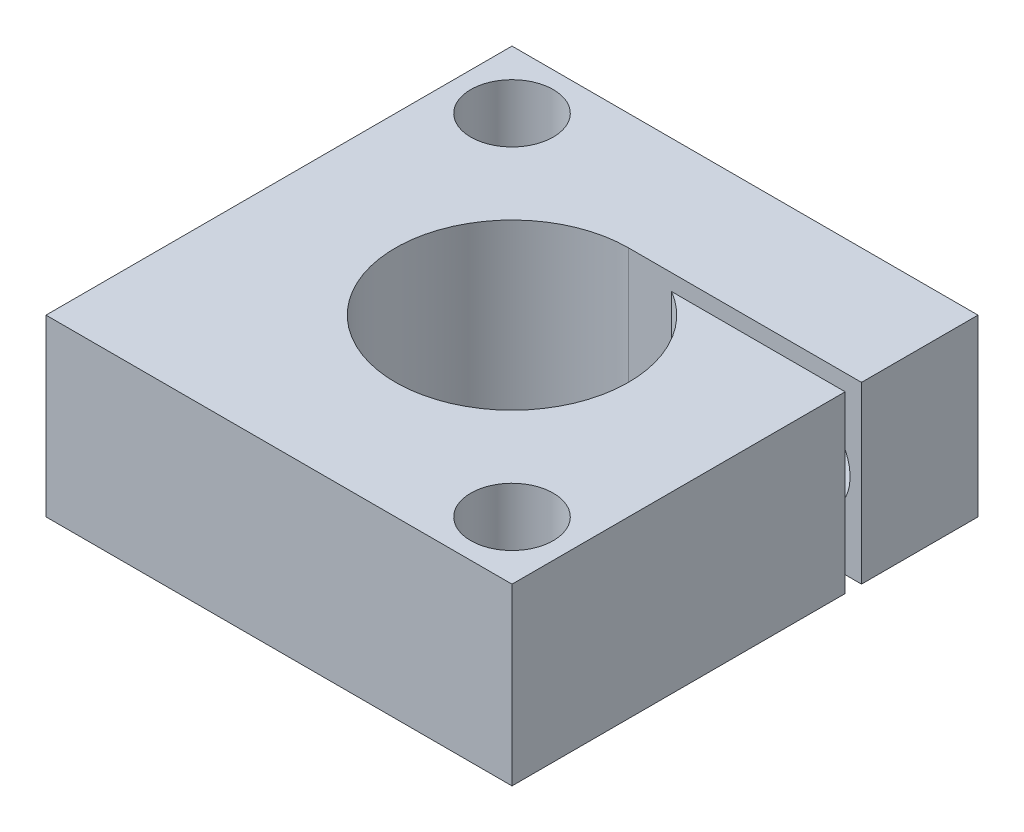
ISO-10303-21;
HEADER;
FILE_DESCRIPTION(('STEP AP214'),'2;1');
FILE_NAME('part.step','',(''),(''),'','','');
FILE_SCHEMA(('AUTOMOTIVE_DESIGN { 1 0 10303 214 1 1 1 1 }'));
ENDSEC;
DATA;
#1=APPLICATION_CONTEXT('core data for automotive mechanical design processes');
#2=APPLICATION_PROTOCOL_DEFINITION('international standard','automotive_design',2000,#1);
#3=PRODUCT_CONTEXT('',#1,'mechanical');
#4=PRODUCT('Part','Part','',(#3));
#5=PRODUCT_RELATED_PRODUCT_CATEGORY('part','',(#4));
#6=PRODUCT_DEFINITION_FORMATION('','',#4);
#7=PRODUCT_DEFINITION_CONTEXT('part definition',#1,'design');
#8=PRODUCT_DEFINITION('design','',#6,#7);
#9=PRODUCT_DEFINITION_SHAPE('','',#8);
#10=(LENGTH_UNIT() NAMED_UNIT(*) SI_UNIT(.MILLI.,.METRE.));
#11=(NAMED_UNIT(*) PLANE_ANGLE_UNIT() SI_UNIT($,.RADIAN.));
#12=(NAMED_UNIT(*) SI_UNIT($,.STERADIAN.) SOLID_ANGLE_UNIT());
#13=UNCERTAINTY_MEASURE_WITH_UNIT(LENGTH_MEASURE(1.E-05),#10,'distance_accuracy_value','');
#14=(GEOMETRIC_REPRESENTATION_CONTEXT(3) GLOBAL_UNCERTAINTY_ASSIGNED_CONTEXT((#13)) GLOBAL_UNIT_ASSIGNED_CONTEXT((#10,
#11,#12)) REPRESENTATION_CONTEXT('',''));
#15=CARTESIAN_POINT('',(0.,0.,0.));
#16=DIRECTION('',(0.,0.,1.));
#17=DIRECTION('',(1.,0.,0.));
#18=AXIS2_PLACEMENT_3D('',#15,#16,#17);
#19=CARTESIAN_POINT('',(-23.8993780326795,9.525,-15.7202520192622));
#20=DIRECTION('',(1.,0.,0.));
#21=DIRECTION('',(0.,0.,-1.));
#22=AXIS2_PLACEMENT_3D('',#19,#20,#21);
#23=PLANE('',#22);
#24=DIRECTION('',(0.,0.,1.));
#25=VECTOR('',#24,1.);
#26=CARTESIAN_POINT('',(-23.8993780326795,0.,-15.7202520192622));
#27=LINE('',#26,#25);
#28=CARTESIAN_POINT('',(-23.8993780326795,0.,-15.7202520192622));
#29=VERTEX_POINT('',#28);
#30=CARTESIAN_POINT('',(-23.8993780326795,0.,9.67974798073775));
#31=VERTEX_POINT('',#30);
#32=EDGE_CURVE('E135',#29,#31,#27,.T.);
#33=ORIENTED_EDGE('',*,*,#32,.T.);
#34=DIRECTION('',(0.,-1.,0.));
#35=VECTOR('',#34,1.);
#36=CARTESIAN_POINT('',(-23.8993780326795,9.525,9.67974798073775));
#37=LINE('',#36,#35);
#38=CARTESIAN_POINT('',(-23.8993780326795,9.525,9.67974798073775));
#39=VERTEX_POINT('',#38);
#40=EDGE_CURVE('E11',#39,#31,#37,.T.);
#41=ORIENTED_EDGE('',*,*,#40,.F.);
#42=DIRECTION('',(0.,0.,1.));
#43=VECTOR('',#42,1.);
#44=CARTESIAN_POINT('',(-23.8993780326795,9.525,-15.7202520192622));
#45=LINE('',#44,#43);
#46=CARTESIAN_POINT('',(-23.8993780326795,9.525,-15.7202520192622));
#47=VERTEX_POINT('',#46);
#48=EDGE_CURVE('E150',#47,#39,#45,.T.);
#49=ORIENTED_EDGE('',*,*,#48,.F.);
#50=DIRECTION('',(0.,-1.,0.));
#51=VECTOR('',#50,1.);
#52=CARTESIAN_POINT('',(-23.8993780326795,9.525,-15.7202520192622));
#53=LINE('',#52,#51);
#54=EDGE_CURVE('E131',#47,#29,#53,.T.);
#55=ORIENTED_EDGE('',*,*,#54,.T.);
#56=EDGE_LOOP('',(#33,#41,#49,#55));
#57=FACE_BOUND('',#56,.T.);
#58=ADVANCED_FACE('F37',(#57),#23,.F.);
#59=CARTESIAN_POINT('',(-23.8993780326795,9.525,9.67974798073775));
#60=DIRECTION('',(0.,0.,-1.));
#61=DIRECTION('',(-1.,0.,0.));
#62=AXIS2_PLACEMENT_3D('',#59,#60,#61);
#63=PLANE('',#62);
#64=DIRECTION('',(1.,0.,0.));
#65=VECTOR('',#64,1.);
#66=CARTESIAN_POINT('',(-23.8993780326795,0.,9.67974798073775));
#67=LINE('',#66,#65);
#68=CARTESIAN_POINT('',(1.50062196732047,0.,9.67974798073775));
#69=VERTEX_POINT('',#68);
#70=EDGE_CURVE('E138',#31,#69,#67,.T.);
#71=ORIENTED_EDGE('',*,*,#70,.T.);
#72=DIRECTION('',(0.,-1.,0.));
#73=VECTOR('',#72,1.);
#74=CARTESIAN_POINT('',(1.50062196732047,9.525,9.67974798073775));
#75=LINE('',#74,#73);
#76=CARTESIAN_POINT('',(1.50062196732047,9.525,9.67974798073775));
#77=VERTEX_POINT('',#76);
#78=EDGE_CURVE('E45',#77,#69,#75,.T.);
#79=ORIENTED_EDGE('',*,*,#78,.F.);
#80=DIRECTION('',(1.,0.,0.));
#81=VECTOR('',#80,1.);
#82=CARTESIAN_POINT('',(-23.8993780326795,9.525,9.67974798073775));
#83=LINE('',#82,#81);
#84=EDGE_CURVE('E97',#39,#77,#83,.T.);
#85=ORIENTED_EDGE('',*,*,#84,.F.);
#86=ORIENTED_EDGE('',*,*,#40,.T.);
#87=EDGE_LOOP('',(#71,#79,#85,#86));
#88=FACE_BOUND('',#87,.T.);
#89=ADVANCED_FACE('F221',(#88),#63,.F.);
#90=CARTESIAN_POINT('',(1.50062196732047,9.525,-8.48125201926225));
#91=DIRECTION('',(-1.,0.,0.));
#92=DIRECTION('',(0.,0.,1.));
#93=AXIS2_PLACEMENT_3D('',#90,#91,#92);
#94=PLANE('',#93);
#95=DIRECTION('',(0.,0.,-1.));
#96=VECTOR('',#95,1.);
#97=CARTESIAN_POINT('',(1.50062196732047,0.,-8.48125201926225));
#98=LINE('',#97,#96);
#99=CARTESIAN_POINT('',(1.50062196732047,0.,-8.48125201926225));
#100=VERTEX_POINT('',#99);
#101=EDGE_CURVE('E141',#69,#100,#98,.T.);
#102=ORIENTED_EDGE('',*,*,#101,.T.);
#103=DIRECTION('',(0.,-1.,0.));
#104=VECTOR('',#103,1.);
#105=CARTESIAN_POINT('',(1.50062196732047,9.525,-8.48125201926225));
#106=LINE('',#105,#104);
#107=CARTESIAN_POINT('',(1.50062196732047,9.525,-8.48125201926225));
#108=VERTEX_POINT('',#107);
#109=EDGE_CURVE('E157',#108,#100,#106,.T.);
#110=ORIENTED_EDGE('',*,*,#109,.F.);
#111=DIRECTION('',(0.,0.,-1.));
#112=VECTOR('',#111,1.);
#113=CARTESIAN_POINT('',(1.50062196732047,9.525,-8.48125201926225));
#114=LINE('',#113,#112);
#115=EDGE_CURVE('E165',#77,#108,#114,.T.);
#116=ORIENTED_EDGE('',*,*,#115,.F.);
#117=ORIENTED_EDGE('',*,*,#78,.T.);
#118=EDGE_LOOP('',(#102,#110,#116,#117));
#119=FACE_BOUND('',#118,.T.);
#120=ADVANCED_FACE('F163',(#119),#94,.F.);
#121=CARTESIAN_POINT('',(-7.95901092384757,9.525,-8.48125201926225));
#122=DIRECTION('',(0.,0.,1.));
#123=DIRECTION('',(1.,0.,0.));
#124=AXIS2_PLACEMENT_3D('',#121,#122,#123);
#125=PLANE('',#124);
#126=CARTESIAN_POINT('',(-1.67437803267953,4.7625,-8.48125201926225));
#127=DIRECTION('',(0.,0.,-1.));
#128=DIRECTION('',(-1.,0.,0.));
#129=AXIS2_PLACEMENT_3D('',#126,#127,#128);
#130=CIRCLE('',#129,1.89865);
#131=CARTESIAN_POINT('',(-3.57302803267953,4.7625,-8.48125201926225));
#132=VERTEX_POINT('',#131);
#133=EDGE_CURVE('E197',#132,#132,#130,.T.);
#134=ORIENTED_EDGE('',*,*,#133,.F.);
#135=EDGE_LOOP('',(#134));
#136=FACE_BOUND('',#135,.T.);
#137=DIRECTION('',(-1.,0.,0.));
#138=VECTOR('',#137,1.);
#139=CARTESIAN_POINT('',(-7.95901092384757,0.,-8.48125201926225));
#140=LINE('',#139,#138);
#141=CARTESIAN_POINT('',(-7.95901092384757,0.,-8.48125201926225));
#142=VERTEX_POINT('',#141);
#143=EDGE_CURVE('E143',#100,#142,#140,.T.);
#144=ORIENTED_EDGE('',*,*,#143,.T.);
#145=DIRECTION('',(0.,-1.,0.));
#146=VECTOR('',#145,1.);
#147=CARTESIAN_POINT('',(-7.95901092384757,9.525,-8.48125201926225));
#148=LINE('',#147,#146);
#149=CARTESIAN_POINT('',(-7.95901092384757,9.525,-8.48125201926225));
#150=VERTEX_POINT('',#149);
#151=EDGE_CURVE('E154',#150,#142,#148,.T.);
#152=ORIENTED_EDGE('',*,*,#151,.F.);
#153=DIRECTION('',(-1.,0.,0.));
#154=VECTOR('',#153,1.);
#155=CARTESIAN_POINT('',(-7.95901092384757,9.525,-8.48125201926225));
#156=LINE('',#155,#154);
#157=EDGE_CURVE('E177',#108,#150,#156,.T.);
#158=ORIENTED_EDGE('',*,*,#157,.F.);
#159=ORIENTED_EDGE('',*,*,#109,.T.);
#160=EDGE_LOOP('',(#144,#152,#158,#159));
#161=FACE_BOUND('',#160,.T.);
#162=ADVANCED_FACE('F173',(#136,#161),#125,.F.);
#163=CARTESIAN_POINT('',(-11.1993780326795,9.525,-3.02025201926225));
#164=DIRECTION('',(0.,-1.,0.));
#165=DIRECTION('',(0.,0.,-1.));
#166=AXIS2_PLACEMENT_3D('',#163,#164,#165);
#167=CYLINDRICAL_SURFACE('',#166,6.35);
#168=CARTESIAN_POINT('',(-11.1993780326795,0.,-3.02025201926225));
#169=DIRECTION('',(0.,-1.,0.));
#170=DIRECTION('',(0.,0.,1.));
#171=AXIS2_PLACEMENT_3D('',#168,#169,#170);
#172=CIRCLE('',#171,6.35);
#173=CARTESIAN_POINT('',(-11.1993780326795,0.,-9.37025201926225));
#174=VERTEX_POINT('',#173);
#175=EDGE_CURVE('E145',#142,#174,#172,.T.);
#176=ORIENTED_EDGE('',*,*,#175,.T.);
#177=DIRECTION('',(0.,-1.,0.));
#178=VECTOR('',#177,1.);
#179=CARTESIAN_POINT('',(-11.1993780326795,9.525,-9.37025201926225));
#180=LINE('',#179,#178);
#181=CARTESIAN_POINT('',(-11.1993780326795,9.525,-9.37025201926225));
#182=VERTEX_POINT('',#181);
#183=EDGE_CURVE('E126',#182,#174,#180,.T.);
#184=ORIENTED_EDGE('',*,*,#183,.F.);
#185=CARTESIAN_POINT('',(-11.1993780326795,9.525,-3.02025201926225));
#186=DIRECTION('',(0.,-1.,0.));
#187=DIRECTION('',(0.,0.,1.));
#188=AXIS2_PLACEMENT_3D('',#185,#186,#187);
#189=CIRCLE('',#188,6.35);
#190=EDGE_CURVE('E117',#150,#182,#189,.T.);
#191=ORIENTED_EDGE('',*,*,#190,.F.);
#192=ORIENTED_EDGE('',*,*,#151,.T.);
#193=EDGE_LOOP('',(#176,#184,#191,#192));
#194=FACE_BOUND('',#193,.T.);
#195=ADVANCED_FACE('F176',(#194),#167,.F.);
#196=CARTESIAN_POINT('',(-11.1993780326795,9.525,-9.37025201926225));
#197=DIRECTION('',(0.,0.,-1.));
#198=DIRECTION('',(-1.,0.,0.));
#199=AXIS2_PLACEMENT_3D('',#196,#197,#198);
#200=PLANE('',#199);
#201=CARTESIAN_POINT('',(-1.67437803267954,4.7625,-9.37025201926225));
#202=DIRECTION('',(0.,0.,-1.));
#203=DIRECTION('',(-1.,0.,0.));
#204=AXIS2_PLACEMENT_3D('',#201,#202,#203);
#205=CIRCLE('',#204,2.55269999999999);
#206=CARTESIAN_POINT('',(-4.22707803267953,4.7625,-9.37025201926225));
#207=VERTEX_POINT('',#206);
#208=EDGE_CURVE('E200',#207,#207,#205,.T.);
#209=ORIENTED_EDGE('',*,*,#208,.T.);
#210=EDGE_LOOP('',(#209));
#211=FACE_BOUND('',#210,.T.);
#212=DIRECTION('',(1.,0.,0.));
#213=VECTOR('',#212,1.);
#214=CARTESIAN_POINT('',(-11.1993780326795,0.,-9.37025201926225));
#215=LINE('',#214,#213);
#216=CARTESIAN_POINT('',(1.50062196732046,0.,-9.37025201926225));
#217=VERTEX_POINT('',#216);
#218=EDGE_CURVE('E125',#174,#217,#215,.T.);
#219=ORIENTED_EDGE('',*,*,#218,.T.);
#220=DIRECTION('',(0.,-1.,0.));
#221=VECTOR('',#220,1.);
#222=CARTESIAN_POINT('',(1.50062196732046,9.525,-9.37025201926225));
#223=LINE('',#222,#221);
#224=CARTESIAN_POINT('',(1.50062196732046,9.525,-9.37025201926225));
#225=VERTEX_POINT('',#224);
#226=EDGE_CURVE('E122',#225,#217,#223,.T.);
#227=ORIENTED_EDGE('',*,*,#226,.F.);
#228=DIRECTION('',(1.,0.,0.));
#229=VECTOR('',#228,1.);
#230=CARTESIAN_POINT('',(-11.1993780326795,9.525,-9.37025201926225));
#231=LINE('',#230,#229);
#232=EDGE_CURVE('E111',#182,#225,#231,.T.);
#233=ORIENTED_EDGE('',*,*,#232,.F.);
#234=ORIENTED_EDGE('',*,*,#183,.T.);
#235=EDGE_LOOP('',(#219,#227,#233,#234));
#236=FACE_BOUND('',#235,.T.);
#237=ADVANCED_FACE('F123',(#211,#236),#200,.F.);
#238=CARTESIAN_POINT('',(1.50062196732046,9.525,-15.7202520192622));
#239=DIRECTION('',(-1.,0.,0.));
#240=DIRECTION('',(0.,0.,1.));
#241=AXIS2_PLACEMENT_3D('',#238,#239,#240);
#242=PLANE('',#241);
#243=DIRECTION('',(0.,0.,-1.));
#244=VECTOR('',#243,1.);
#245=CARTESIAN_POINT('',(1.50062196732046,0.,-15.7202520192622));
#246=LINE('',#245,#244);
#247=CARTESIAN_POINT('',(1.50062196732046,0.,-15.7202520192622));
#248=VERTEX_POINT('',#247);
#249=EDGE_CURVE('E83',#217,#248,#246,.T.);
#250=ORIENTED_EDGE('',*,*,#249,.T.);
#251=DIRECTION('',(0.,-1.,0.));
#252=VECTOR('',#251,1.);
#253=CARTESIAN_POINT('',(1.50062196732046,9.525,-15.7202520192622));
#254=LINE('',#253,#252);
#255=CARTESIAN_POINT('',(1.50062196732046,9.525,-15.7202520192622));
#256=VERTEX_POINT('',#255);
#257=EDGE_CURVE('E127',#256,#248,#254,.T.);
#258=ORIENTED_EDGE('',*,*,#257,.F.);
#259=DIRECTION('',(0.,0.,-1.));
#260=VECTOR('',#259,1.);
#261=CARTESIAN_POINT('',(1.50062196732046,9.525,-15.7202520192622));
#262=LINE('',#261,#260);
#263=EDGE_CURVE('E115',#225,#256,#262,.T.);
#264=ORIENTED_EDGE('',*,*,#263,.F.);
#265=ORIENTED_EDGE('',*,*,#226,.T.);
#266=EDGE_LOOP('',(#250,#258,#264,#265));
#267=FACE_BOUND('',#266,.T.);
#268=ADVANCED_FACE('F129',(#267),#242,.F.);
#269=CARTESIAN_POINT('',(-23.8993780326795,9.525,-15.7202520192622));
#270=DIRECTION('',(0.,0.,1.));
#271=DIRECTION('',(1.,0.,0.));
#272=AXIS2_PLACEMENT_3D('',#269,#270,#271);
#273=PLANE('',#272);
#274=CARTESIAN_POINT('',(-1.67437803267954,4.7625,-15.7202520192622));
#275=DIRECTION('',(0.,0.,-1.));
#276=DIRECTION('',(-1.,0.,0.));
#277=AXIS2_PLACEMENT_3D('',#274,#275,#276);
#278=CIRCLE('',#277,2.55269999999999);
#279=CARTESIAN_POINT('',(-4.22707803267952,4.7625,-15.7202520192622));
#280=VERTEX_POINT('',#279);
#281=EDGE_CURVE('E203',#280,#280,#278,.T.);
#282=ORIENTED_EDGE('',*,*,#281,.F.);
#283=EDGE_LOOP('',(#282));
#284=FACE_BOUND('',#283,.T.);
#285=DIRECTION('',(-1.,0.,0.));
#286=VECTOR('',#285,1.);
#287=CARTESIAN_POINT('',(-23.8993780326795,0.,-15.7202520192622));
#288=LINE('',#287,#286);
#289=EDGE_CURVE('E89',#248,#29,#288,.T.);
#290=ORIENTED_EDGE('',*,*,#289,.T.);
#291=ORIENTED_EDGE('',*,*,#54,.F.);
#292=DIRECTION('',(-1.,0.,0.));
#293=VECTOR('',#292,1.);
#294=CARTESIAN_POINT('',(-23.8993780326795,9.525,-15.7202520192622));
#295=LINE('',#294,#293);
#296=EDGE_CURVE('E53',#256,#47,#295,.T.);
#297=ORIENTED_EDGE('',*,*,#296,.F.);
#298=ORIENTED_EDGE('',*,*,#257,.T.);
#299=EDGE_LOOP('',(#290,#291,#297,#298));
#300=FACE_BOUND('',#299,.T.);
#301=ADVANCED_FACE('F209',(#284,#300),#273,.F.);
#302=CARTESIAN_POINT('',(-11.1993780326795,9.525,-3.02025201926225));
#303=DIRECTION('',(0.,1.,0.));
#304=DIRECTION('',(0.,0.,1.));
#305=AXIS2_PLACEMENT_3D('',#302,#303,#304);
#306=PLANE('',#305);
#307=CARTESIAN_POINT('',(-20.7243780326795,9.525,-12.5452520192622));
#308=DIRECTION('',(0.,1.,0.));
#309=DIRECTION('',(0.,0.,1.));
#310=AXIS2_PLACEMENT_3D('',#307,#308,#309);
#311=CIRCLE('',#310,2.24789999999999);
#312=CARTESIAN_POINT('',(-20.7243780326795,9.525,-10.2973520192623));
#313=VERTEX_POINT('',#312);
#314=EDGE_CURVE('E191',#313,#313,#311,.T.);
#315=ORIENTED_EDGE('',*,*,#314,.F.);
#316=EDGE_LOOP('',(#315));
#317=FACE_BOUND('',#316,.T.);
#318=CARTESIAN_POINT('',(-1.67437803267953,9.525,6.50474798073775));
#319=DIRECTION('',(0.,1.,0.));
#320=DIRECTION('',(0.,0.,1.));
#321=AXIS2_PLACEMENT_3D('',#318,#319,#320);
#322=CIRCLE('',#321,2.24789999999999);
#323=CARTESIAN_POINT('',(-1.67437803267953,9.525,8.75264798073774));
#324=VERTEX_POINT('',#323);
#325=EDGE_CURVE('E185',#324,#324,#322,.T.);
#326=ORIENTED_EDGE('',*,*,#325,.F.);
#327=EDGE_LOOP('',(#326));
#328=FACE_BOUND('',#327,.T.);
#329=ORIENTED_EDGE('',*,*,#48,.T.);
#330=ORIENTED_EDGE('',*,*,#84,.T.);
#331=ORIENTED_EDGE('',*,*,#115,.T.);
#332=ORIENTED_EDGE('',*,*,#157,.T.);
#333=ORIENTED_EDGE('',*,*,#190,.T.);
#334=ORIENTED_EDGE('',*,*,#232,.T.);
#335=ORIENTED_EDGE('',*,*,#263,.T.);
#336=ORIENTED_EDGE('',*,*,#296,.T.);
#337=EDGE_LOOP('',(#329,#330,#331,#332,#333,#334,#335,#336));
#338=FACE_BOUND('',#337,.T.);
#339=ADVANCED_FACE('F113',(#317,#328,#338),#306,.T.);
#340=CARTESIAN_POINT('',(-11.1993780326795,0.,-3.02025201926225));
#341=DIRECTION('',(0.,1.,0.));
#342=DIRECTION('',(0.,0.,1.));
#343=AXIS2_PLACEMENT_3D('',#340,#341,#342);
#344=PLANE('',#343);
#345=CARTESIAN_POINT('',(-20.7243780326795,0.,-12.5452520192622));
#346=DIRECTION('',(0.,1.,0.));
#347=DIRECTION('',(0.,0.,1.));
#348=AXIS2_PLACEMENT_3D('',#345,#346,#347);
#349=CIRCLE('',#348,2.2479);
#350=CARTESIAN_POINT('',(-20.7243780326795,0.,-10.2973520192623));
#351=VERTEX_POINT('',#350);
#352=EDGE_CURVE('E188',#351,#351,#349,.T.);
#353=ORIENTED_EDGE('',*,*,#352,.T.);
#354=EDGE_LOOP('',(#353));
#355=FACE_BOUND('',#354,.T.);
#356=CARTESIAN_POINT('',(-1.67437803267953,0.,6.50474798073775));
#357=DIRECTION('',(0.,1.,0.));
#358=DIRECTION('',(0.,0.,1.));
#359=AXIS2_PLACEMENT_3D('',#356,#357,#358);
#360=CIRCLE('',#359,2.2479);
#361=CARTESIAN_POINT('',(-1.67437803267953,0.,8.75264798073775));
#362=VERTEX_POINT('',#361);
#363=EDGE_CURVE('E139',#362,#362,#360,.T.);
#364=ORIENTED_EDGE('',*,*,#363,.T.);
#365=EDGE_LOOP('',(#364));
#366=FACE_BOUND('',#365,.T.);
#367=ORIENTED_EDGE('',*,*,#32,.F.);
#368=ORIENTED_EDGE('',*,*,#289,.F.);
#369=ORIENTED_EDGE('',*,*,#249,.F.);
#370=ORIENTED_EDGE('',*,*,#218,.F.);
#371=ORIENTED_EDGE('',*,*,#175,.F.);
#372=ORIENTED_EDGE('',*,*,#143,.F.);
#373=ORIENTED_EDGE('',*,*,#101,.F.);
#374=ORIENTED_EDGE('',*,*,#70,.F.);
#375=EDGE_LOOP('',(#367,#368,#369,#370,#371,#372,#373,#374));
#376=FACE_BOUND('',#375,.T.);
#377=ADVANCED_FACE('F169',(#355,#366,#376),#344,.F.);
#378=CARTESIAN_POINT('',(-1.67437803267953,9.525,6.50474798073775));
#379=DIRECTION('',(0.,1.,0.));
#380=DIRECTION('',(0.,0.,1.));
#381=AXIS2_PLACEMENT_3D('',#378,#379,#380);
#382=CYLINDRICAL_SURFACE('',#381,2.24789999999999);
#383=ORIENTED_EDGE('',*,*,#363,.F.);
#384=EDGE_LOOP('',(#383));
#385=FACE_BOUND('',#384,.T.);
#386=ORIENTED_EDGE('',*,*,#325,.T.);
#387=EDGE_LOOP('',(#386));
#388=FACE_BOUND('',#387,.T.);
#389=ADVANCED_FACE('F260',(#385,#388),#382,.F.);
#390=CARTESIAN_POINT('',(-20.7243780326795,9.525,-12.5452520192622));
#391=DIRECTION('',(0.,1.,0.));
#392=DIRECTION('',(0.,0.,1.));
#393=AXIS2_PLACEMENT_3D('',#390,#391,#392);
#394=CYLINDRICAL_SURFACE('',#393,2.24789999999999);
#395=ORIENTED_EDGE('',*,*,#352,.F.);
#396=EDGE_LOOP('',(#395));
#397=FACE_BOUND('',#396,.T.);
#398=ORIENTED_EDGE('',*,*,#314,.T.);
#399=EDGE_LOOP('',(#398));
#400=FACE_BOUND('',#399,.T.);
#401=ADVANCED_FACE('F256',(#397,#400),#394,.F.);
#402=CARTESIAN_POINT('',(-1.67437803267953,4.7625,2.69474798073775));
#403=DIRECTION('',(0.,0.,-1.));
#404=DIRECTION('',(-1.,0.,0.));
#405=AXIS2_PLACEMENT_3D('',#402,#403,#404);
#406=CONICAL_SURFACE('',#405,1.89865,1.02974425867665);
#407=CARTESIAN_POINT('',(-1.67437803267954,4.7625,3.83557199505443));
#408=VERTEX_POINT('',#407);
#409=VERTEX_LOOP('',#408);
#410=FACE_BOUND('',#409,.T.);
#411=CARTESIAN_POINT('',(-1.67437803267953,4.7625,2.69474798073775));
#412=DIRECTION('',(0.,0.,-1.));
#413=DIRECTION('',(-1.,0.,0.));
#414=AXIS2_PLACEMENT_3D('',#411,#412,#413);
#415=CIRCLE('',#414,1.89865);
#416=CARTESIAN_POINT('',(-3.57302803267953,4.7625,2.69474798073775));
#417=VERTEX_POINT('',#416);
#418=EDGE_CURVE('E194',#417,#417,#415,.T.);
#419=ORIENTED_EDGE('',*,*,#418,.T.);
#420=EDGE_LOOP('',(#419));
#421=FACE_BOUND('',#420,.T.);
#422=ADVANCED_FACE('F250',(#410,#421),#406,.F.);
#423=CARTESIAN_POINT('',(-1.67437803267953,4.7625,-8.48125201926225));
#424=DIRECTION('',(0.,0.,-1.));
#425=DIRECTION('',(-1.,0.,0.));
#426=AXIS2_PLACEMENT_3D('',#423,#424,#425);
#427=CYLINDRICAL_SURFACE('',#426,1.89865);
#428=ORIENTED_EDGE('',*,*,#418,.F.);
#429=EDGE_LOOP('',(#428));
#430=FACE_BOUND('',#429,.T.);
#431=ORIENTED_EDGE('',*,*,#133,.T.);
#432=EDGE_LOOP('',(#431));
#433=FACE_BOUND('',#432,.T.);
#434=ADVANCED_FACE('F245',(#430,#433),#427,.F.);
#435=CARTESIAN_POINT('',(-1.67437803267954,4.7625,-15.7202520192622));
#436=DIRECTION('',(0.,0.,-1.));
#437=DIRECTION('',(-1.,0.,0.));
#438=AXIS2_PLACEMENT_3D('',#435,#436,#437);
#439=CYLINDRICAL_SURFACE('',#438,2.55269999999999);
#440=ORIENTED_EDGE('',*,*,#208,.F.);
#441=EDGE_LOOP('',(#440));
#442=FACE_BOUND('',#441,.T.);
#443=ORIENTED_EDGE('',*,*,#281,.T.);
#444=EDGE_LOOP('',(#443));
#445=FACE_BOUND('',#444,.T.);
#446=ADVANCED_FACE('F207',(#442,#445),#439,.F.);
#447=CLOSED_SHELL('',(#58,#89,#120,#162,#195,#237,#268,#301,#339,#377,#389,#401,#422,#434,#446));
#448=MANIFOLD_SOLID_BREP('B2',#447);
#449=ADVANCED_BREP_SHAPE_REPRESENTATION('',(#18,#448),#14);
#450=SHAPE_DEFINITION_REPRESENTATION(#9,#449);
ENDSEC;
END-ISO-10303-21;
